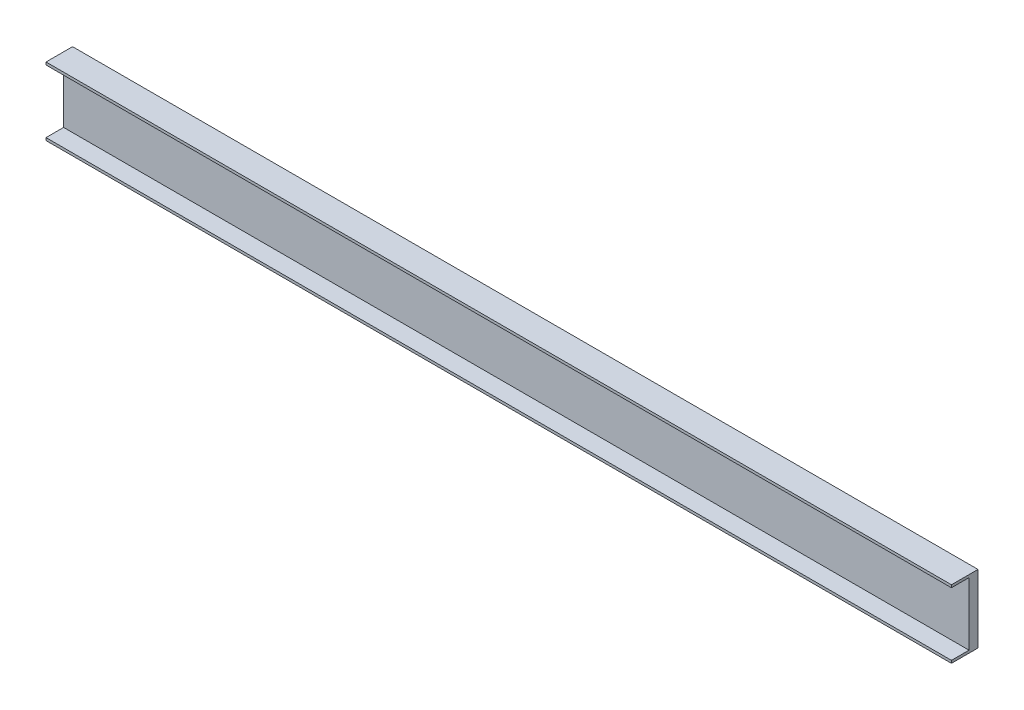
ISO-10303-21;
HEADER;
FILE_DESCRIPTION(('STEP AP214'),'2;1');
FILE_NAME('part.step','',(''),(''),'','','');
FILE_SCHEMA(('AUTOMOTIVE_DESIGN { 1 0 10303 214 1 1 1 1 }'));
ENDSEC;
DATA;
#1=APPLICATION_CONTEXT('core data for automotive mechanical design processes');
#2=APPLICATION_PROTOCOL_DEFINITION('international standard','automotive_design',2000,#1);
#3=PRODUCT_CONTEXT('',#1,'mechanical');
#4=PRODUCT('Part','Part','',(#3));
#5=PRODUCT_RELATED_PRODUCT_CATEGORY('part','',(#4));
#6=PRODUCT_DEFINITION_FORMATION('','',#4);
#7=PRODUCT_DEFINITION_CONTEXT('part definition',#1,'design');
#8=PRODUCT_DEFINITION('design','',#6,#7);
#9=PRODUCT_DEFINITION_SHAPE('','',#8);
#10=(LENGTH_UNIT() NAMED_UNIT(*) SI_UNIT(.MILLI.,.METRE.));
#11=(NAMED_UNIT(*) PLANE_ANGLE_UNIT() SI_UNIT($,.RADIAN.));
#12=(NAMED_UNIT(*) SI_UNIT($,.STERADIAN.) SOLID_ANGLE_UNIT());
#13=UNCERTAINTY_MEASURE_WITH_UNIT(LENGTH_MEASURE(1.E-05),#10,'distance_accuracy_value','');
#14=(GEOMETRIC_REPRESENTATION_CONTEXT(3) GLOBAL_UNCERTAINTY_ASSIGNED_CONTEXT((#13)) GLOBAL_UNIT_ASSIGNED_CONTEXT((#10,
#11,#12)) REPRESENTATION_CONTEXT('',''));
#15=CARTESIAN_POINT('',(0.,0.,0.));
#16=DIRECTION('',(0.,0.,1.));
#17=DIRECTION('',(1.,0.,0.));
#18=AXIS2_PLACEMENT_3D('',#15,#16,#17);
#19=CARTESIAN_POINT('',(-1995.,-150.,0.));
#20=DIRECTION('',(0.,0.,1.));
#21=DIRECTION('',(1.,0.,0.));
#22=AXIS2_PLACEMENT_3D('',#19,#20,#21);
#23=PLANE('',#22);
#24=DIRECTION('',(0.,1.,0.));
#25=VECTOR('',#24,1.);
#26=CARTESIAN_POINT('',(865.,115.,0.));
#27=LINE('',#26,#25);
#28=CARTESIAN_POINT('',(865.,-115.,0.));
#29=VERTEX_POINT('',#28);
#30=CARTESIAN_POINT('',(865.,115.,0.));
#31=VERTEX_POINT('',#30);
#32=EDGE_CURVE('E265',#29,#31,#27,.T.);
#33=ORIENTED_EDGE('',*,*,#32,.F.);
#34=DIRECTION('',(-1.,0.,0.));
#35=VECTOR('',#34,1.);
#36=CARTESIAN_POINT('',(865.,-115.,0.));
#37=LINE('',#36,#35);
#38=CARTESIAN_POINT('',(935.,-115.,0.));
#39=VERTEX_POINT('',#38);
#40=EDGE_CURVE('E278',#39,#29,#37,.T.);
#41=ORIENTED_EDGE('',*,*,#40,.F.);
#42=DIRECTION('',(0.,-1.,0.));
#43=VECTOR('',#42,1.);
#44=CARTESIAN_POINT('',(935.,115.,0.));
#45=LINE('',#44,#43);
#46=CARTESIAN_POINT('',(935.,115.,0.));
#47=VERTEX_POINT('',#46);
#48=EDGE_CURVE('E287',#47,#39,#45,.T.);
#49=ORIENTED_EDGE('',*,*,#48,.F.);
#50=DIRECTION('',(1.,0.,0.));
#51=VECTOR('',#50,1.);
#52=CARTESIAN_POINT('',(865.,115.,0.));
#53=LINE('',#52,#51);
#54=EDGE_CURVE('E268',#31,#47,#53,.T.);
#55=ORIENTED_EDGE('',*,*,#54,.F.);
#56=EDGE_LOOP('',(#33,#41,#49,#55));
#57=FACE_BOUND('',#56,.T.);
#58=DIRECTION('',(0.,1.,0.));
#59=VECTOR('',#58,1.);
#60=CARTESIAN_POINT('',(-535.,-115.,0.));
#61=LINE('',#60,#59);
#62=CARTESIAN_POINT('',(-535.,-115.,0.));
#63=VERTEX_POINT('',#62);
#64=CARTESIAN_POINT('',(-535.,115.,0.));
#65=VERTEX_POINT('',#64);
#66=EDGE_CURVE('E336',#63,#65,#61,.T.);
#67=ORIENTED_EDGE('',*,*,#66,.F.);
#68=DIRECTION('',(-1.,0.,0.));
#69=VECTOR('',#68,1.);
#70=CARTESIAN_POINT('',(-535.,-115.,0.));
#71=LINE('',#70,#69);
#72=CARTESIAN_POINT('',(-465.,-115.,0.));
#73=VERTEX_POINT('',#72);
#74=EDGE_CURVE('E341',#73,#63,#71,.T.);
#75=ORIENTED_EDGE('',*,*,#74,.F.);
#76=DIRECTION('',(0.,-1.,0.));
#77=VECTOR('',#76,1.);
#78=CARTESIAN_POINT('',(-465.,-115.,0.));
#79=LINE('',#78,#77);
#80=CARTESIAN_POINT('',(-465.,115.,0.));
#81=VERTEX_POINT('',#80);
#82=EDGE_CURVE('E353',#81,#73,#79,.T.);
#83=ORIENTED_EDGE('',*,*,#82,.F.);
#84=DIRECTION('',(1.,0.,0.));
#85=VECTOR('',#84,1.);
#86=CARTESIAN_POINT('',(-535.,115.,0.));
#87=LINE('',#86,#85);
#88=EDGE_CURVE('E350',#65,#81,#87,.T.);
#89=ORIENTED_EDGE('',*,*,#88,.F.);
#90=EDGE_LOOP('',(#67,#75,#83,#89));
#91=FACE_BOUND('',#90,.T.);
#92=DIRECTION('',(0.,-1.,0.));
#93=VECTOR('',#92,1.);
#94=CARTESIAN_POINT('',(-1265.,115.,0.));
#95=LINE('',#94,#93);
#96=CARTESIAN_POINT('',(-1265.,115.,0.));
#97=VERTEX_POINT('',#96);
#98=CARTESIAN_POINT('',(-1265.,-115.,0.));
#99=VERTEX_POINT('',#98);
#100=EDGE_CURVE('E402',#97,#99,#95,.T.);
#101=ORIENTED_EDGE('',*,*,#100,.F.);
#102=DIRECTION('',(1.,0.,0.));
#103=VECTOR('',#102,1.);
#104=CARTESIAN_POINT('',(-1265.,115.,0.));
#105=LINE('',#104,#103);
#106=CARTESIAN_POINT('',(-1335.,115.,0.));
#107=VERTEX_POINT('',#106);
#108=EDGE_CURVE('E407',#107,#97,#105,.T.);
#109=ORIENTED_EDGE('',*,*,#108,.F.);
#110=DIRECTION('',(0.,1.,0.));
#111=VECTOR('',#110,1.);
#112=CARTESIAN_POINT('',(-1335.,115.,0.));
#113=LINE('',#112,#111);
#114=CARTESIAN_POINT('',(-1335.,-115.,0.));
#115=VERTEX_POINT('',#114);
#116=EDGE_CURVE('E419',#115,#107,#113,.T.);
#117=ORIENTED_EDGE('',*,*,#116,.F.);
#118=DIRECTION('',(-1.,0.,0.));
#119=VECTOR('',#118,1.);
#120=CARTESIAN_POINT('',(-1265.,-115.,0.));
#121=LINE('',#120,#119);
#122=EDGE_CURVE('E416',#99,#115,#121,.T.);
#123=ORIENTED_EDGE('',*,*,#122,.F.);
#124=EDGE_LOOP('',(#101,#109,#117,#123));
#125=FACE_BOUND('',#124,.T.);
#126=DIRECTION('',(0.,-1.,0.));
#127=VECTOR('',#126,1.);
#128=CARTESIAN_POINT('',(-1995.,150.,0.));
#129=LINE('',#128,#127);
#130=CARTESIAN_POINT('',(-1995.,150.,0.));
#131=VERTEX_POINT('',#130);
#132=CARTESIAN_POINT('',(-1995.,-150.,0.));
#133=VERTEX_POINT('',#132);
#134=EDGE_CURVE('E481',#131,#133,#129,.T.);
#135=ORIENTED_EDGE('',*,*,#134,.F.);
#136=DIRECTION('',(-1.,0.,0.));
#137=VECTOR('',#136,1.);
#138=CARTESIAN_POINT('',(-1995.,150.,0.));
#139=LINE('',#138,#137);
#140=CARTESIAN_POINT('',(1995.,150.,0.));
#141=VERTEX_POINT('',#140);
#142=EDGE_CURVE('E496',#141,#131,#139,.T.);
#143=ORIENTED_EDGE('',*,*,#142,.F.);
#144=DIRECTION('',(0.,1.,0.));
#145=VECTOR('',#144,1.);
#146=CARTESIAN_POINT('',(1995.,150.,0.));
#147=LINE('',#146,#145);
#148=CARTESIAN_POINT('',(1995.,-150.,0.));
#149=VERTEX_POINT('',#148);
#150=EDGE_CURVE('E491',#149,#141,#147,.T.);
#151=ORIENTED_EDGE('',*,*,#150,.F.);
#152=DIRECTION('',(1.,0.,0.));
#153=VECTOR('',#152,1.);
#154=CARTESIAN_POINT('',(-1995.,-150.,0.));
#155=LINE('',#154,#153);
#156=EDGE_CURVE('E486',#133,#149,#155,.T.);
#157=ORIENTED_EDGE('',*,*,#156,.F.);
#158=EDGE_LOOP('',(#135,#143,#151,#157));
#159=FACE_BOUND('',#158,.T.);
#160=DIRECTION('',(0.,-1.,0.));
#161=VECTOR('',#160,1.);
#162=CARTESIAN_POINT('',(-865.,115.,0.));
#163=LINE('',#162,#161);
#164=CARTESIAN_POINT('',(-865.,115.,0.));
#165=VERTEX_POINT('',#164);
#166=CARTESIAN_POINT('',(-865.,-115.,0.));
#167=VERTEX_POINT('',#166);
#168=EDGE_CURVE('E369',#165,#167,#163,.T.);
#169=ORIENTED_EDGE('',*,*,#168,.F.);
#170=DIRECTION('',(1.,0.,0.));
#171=VECTOR('',#170,1.);
#172=CARTESIAN_POINT('',(-865.,115.,0.));
#173=LINE('',#172,#171);
#174=CARTESIAN_POINT('',(-935.,115.,0.));
#175=VERTEX_POINT('',#174);
#176=EDGE_CURVE('E374',#175,#165,#173,.T.);
#177=ORIENTED_EDGE('',*,*,#176,.F.);
#178=DIRECTION('',(0.,1.,0.));
#179=VECTOR('',#178,1.);
#180=CARTESIAN_POINT('',(-935.,115.,0.));
#181=LINE('',#180,#179);
#182=CARTESIAN_POINT('',(-935.,-115.,0.));
#183=VERTEX_POINT('',#182);
#184=EDGE_CURVE('E386',#183,#175,#181,.T.);
#185=ORIENTED_EDGE('',*,*,#184,.F.);
#186=DIRECTION('',(-1.,0.,0.));
#187=VECTOR('',#186,1.);
#188=CARTESIAN_POINT('',(-865.,-115.,0.));
#189=LINE('',#188,#187);
#190=EDGE_CURVE('E383',#167,#183,#189,.T.);
#191=ORIENTED_EDGE('',*,*,#190,.F.);
#192=EDGE_LOOP('',(#169,#177,#185,#191));
#193=FACE_BOUND('',#192,.T.);
#194=DIRECTION('',(0.,1.,0.));
#195=VECTOR('',#194,1.);
#196=CARTESIAN_POINT('',(1265.,115.,0.));
#197=LINE('',#196,#195);
#198=CARTESIAN_POINT('',(1265.,-115.,0.));
#199=VERTEX_POINT('',#198);
#200=CARTESIAN_POINT('',(1265.,115.,0.));
#201=VERTEX_POINT('',#200);
#202=EDGE_CURVE('E303',#199,#201,#197,.T.);
#203=ORIENTED_EDGE('',*,*,#202,.F.);
#204=DIRECTION('',(-1.,0.,0.));
#205=VECTOR('',#204,1.);
#206=CARTESIAN_POINT('',(1265.,-115.,0.));
#207=LINE('',#206,#205);
#208=CARTESIAN_POINT('',(1335.,-115.,0.));
#209=VERTEX_POINT('',#208);
#210=EDGE_CURVE('E308',#209,#199,#207,.T.);
#211=ORIENTED_EDGE('',*,*,#210,.F.);
#212=DIRECTION('',(0.,-1.,0.));
#213=VECTOR('',#212,1.);
#214=CARTESIAN_POINT('',(1335.,115.,0.));
#215=LINE('',#214,#213);
#216=CARTESIAN_POINT('',(1335.,115.,0.));
#217=VERTEX_POINT('',#216);
#218=EDGE_CURVE('E320',#217,#209,#215,.T.);
#219=ORIENTED_EDGE('',*,*,#218,.F.);
#220=DIRECTION('',(1.,0.,0.));
#221=VECTOR('',#220,1.);
#222=CARTESIAN_POINT('',(1265.,115.,0.));
#223=LINE('',#222,#221);
#224=EDGE_CURVE('E317',#201,#217,#223,.T.);
#225=ORIENTED_EDGE('',*,*,#224,.F.);
#226=EDGE_LOOP('',(#203,#211,#219,#225));
#227=FACE_BOUND('',#226,.T.);
#228=DIRECTION('',(-1.,0.,0.));
#229=VECTOR('',#228,1.);
#230=CARTESIAN_POINT('',(535.,-115.,0.));
#231=LINE('',#230,#229);
#232=CARTESIAN_POINT('',(535.,-115.,0.));
#233=VERTEX_POINT('',#232);
#234=CARTESIAN_POINT('',(465.,-115.,0.));
#235=VERTEX_POINT('',#234);
#236=EDGE_CURVE('E264',#233,#235,#231,.T.);
#237=ORIENTED_EDGE('',*,*,#236,.F.);
#238=DIRECTION('',(0.,-1.,0.));
#239=VECTOR('',#238,1.);
#240=CARTESIAN_POINT('',(535.,-115.,0.));
#241=LINE('',#240,#239);
#242=CARTESIAN_POINT('',(535.,115.,0.));
#243=VERTEX_POINT('',#242);
#244=EDGE_CURVE('E261',#243,#233,#241,.T.);
#245=ORIENTED_EDGE('',*,*,#244,.F.);
#246=DIRECTION('',(1.,0.,0.));
#247=VECTOR('',#246,1.);
#248=CARTESIAN_POINT('',(535.,115.,0.));
#249=LINE('',#248,#247);
#250=CARTESIAN_POINT('',(465.,115.,0.));
#251=VERTEX_POINT('',#250);
#252=EDGE_CURVE('E55',#251,#243,#249,.T.);
#253=ORIENTED_EDGE('',*,*,#252,.F.);
#254=DIRECTION('',(0.,1.,0.));
#255=VECTOR('',#254,1.);
#256=CARTESIAN_POINT('',(465.,-115.,0.));
#257=LINE('',#256,#255);
#258=EDGE_CURVE('E50',#235,#251,#257,.T.);
#259=ORIENTED_EDGE('',*,*,#258,.F.);
#260=EDGE_LOOP('',(#237,#245,#253,#259));
#261=FACE_BOUND('',#260,.T.);
#262=ADVANCED_FACE('F32',(#57,#91,#125,#159,#193,#227,#261),#23,.F.);
#263=CARTESIAN_POINT('',(-1995.,-150.,39.5));
#264=DIRECTION('',(0.,0.,1.));
#265=DIRECTION('',(1.,0.,0.));
#266=AXIS2_PLACEMENT_3D('',#263,#264,#265);
#267=PLANE('',#266);
#268=DIRECTION('',(0.,-1.,0.));
#269=VECTOR('',#268,1.);
#270=CARTESIAN_POINT('',(-1995.,150.,39.5));
#271=LINE('',#270,#269);
#272=CARTESIAN_POINT('',(-1995.,138.5,39.5));
#273=VERTEX_POINT('',#272);
#274=CARTESIAN_POINT('',(-1995.,-138.5,39.5));
#275=VERTEX_POINT('',#274);
#276=EDGE_CURVE('E474',#273,#275,#271,.T.);
#277=ORIENTED_EDGE('',*,*,#276,.T.);
#278=DIRECTION('',(-1.,0.,0.));
#279=VECTOR('',#278,1.);
#280=CARTESIAN_POINT('',(-1995.,-138.5,39.5));
#281=LINE('',#280,#279);
#282=CARTESIAN_POINT('',(1995.,-138.5,39.5));
#283=VERTEX_POINT('',#282);
#284=EDGE_CURVE('E435',#283,#275,#281,.T.);
#285=ORIENTED_EDGE('',*,*,#284,.F.);
#286=DIRECTION('',(0.,1.,0.));
#287=VECTOR('',#286,1.);
#288=CARTESIAN_POINT('',(1995.,150.,39.5));
#289=LINE('',#288,#287);
#290=CARTESIAN_POINT('',(1995.,138.5,39.5));
#291=VERTEX_POINT('',#290);
#292=EDGE_CURVE('E36',#283,#291,#289,.T.);
#293=ORIENTED_EDGE('',*,*,#292,.T.);
#294=DIRECTION('',(1.,0.,0.));
#295=VECTOR('',#294,1.);
#296=CARTESIAN_POINT('',(-1995.,138.5,39.5));
#297=LINE('',#296,#295);
#298=EDGE_CURVE('E454',#273,#291,#297,.T.);
#299=ORIENTED_EDGE('',*,*,#298,.F.);
#300=EDGE_LOOP('',(#277,#285,#293,#299));
#301=FACE_BOUND('',#300,.T.);
#302=ADVANCED_FACE('F526',(#301),#267,.T.);
#303=CARTESIAN_POINT('',(-1995.,150.,39.5));
#304=DIRECTION('',(1.,0.,0.));
#305=DIRECTION('',(0.,0.,-1.));
#306=AXIS2_PLACEMENT_3D('',#303,#304,#305);
#307=PLANE('',#306);
#308=ORIENTED_EDGE('',*,*,#134,.T.);
#309=DIRECTION('',(0.,0.,-1.));
#310=VECTOR('',#309,1.);
#311=CARTESIAN_POINT('',(-1995.,-150.,39.5));
#312=LINE('',#311,#310);
#313=CARTESIAN_POINT('',(-1995.,-150.,117.));
#314=VERTEX_POINT('',#313);
#315=EDGE_CURVE('E11',#314,#133,#312,.T.);
#316=ORIENTED_EDGE('',*,*,#315,.F.);
#317=DIRECTION('',(0.,-1.,0.));
#318=VECTOR('',#317,1.);
#319=CARTESIAN_POINT('',(-1995.,-150.,117.));
#320=LINE('',#319,#318);
#321=CARTESIAN_POINT('',(-1995.,-138.5,117.));
#322=VERTEX_POINT('',#321);
#323=EDGE_CURVE('E443',#322,#314,#320,.T.);
#324=ORIENTED_EDGE('',*,*,#323,.F.);
#325=DIRECTION('',(0.,0.,-1.));
#326=VECTOR('',#325,1.);
#327=CARTESIAN_POINT('',(-1995.,-138.5,117.));
#328=LINE('',#327,#326);
#329=EDGE_CURVE('E446',#322,#275,#328,.T.);
#330=ORIENTED_EDGE('',*,*,#329,.T.);
#331=ORIENTED_EDGE('',*,*,#276,.F.);
#332=DIRECTION('',(0.,0.,-1.));
#333=VECTOR('',#332,1.);
#334=CARTESIAN_POINT('',(-1995.,138.5,117.));
#335=LINE('',#334,#333);
#336=CARTESIAN_POINT('',(-1995.,138.5,117.));
#337=VERTEX_POINT('',#336);
#338=EDGE_CURVE('E477',#337,#273,#335,.T.);
#339=ORIENTED_EDGE('',*,*,#338,.F.);
#340=DIRECTION('',(0.,-1.,0.));
#341=VECTOR('',#340,1.);
#342=CARTESIAN_POINT('',(-1995.,150.,117.));
#343=LINE('',#342,#341);
#344=CARTESIAN_POINT('',(-1995.,150.,117.));
#345=VERTEX_POINT('',#344);
#346=EDGE_CURVE('E455',#345,#337,#343,.T.);
#347=ORIENTED_EDGE('',*,*,#346,.F.);
#348=DIRECTION('',(0.,0.,-1.));
#349=VECTOR('',#348,1.);
#350=CARTESIAN_POINT('',(-1995.,150.,39.5));
#351=LINE('',#350,#349);
#352=EDGE_CURVE('E498',#345,#131,#351,.T.);
#353=ORIENTED_EDGE('',*,*,#352,.T.);
#354=EDGE_LOOP('',(#308,#316,#324,#330,#331,#339,#347,#353));
#355=FACE_BOUND('',#354,.T.);
#356=ADVANCED_FACE('F34',(#355),#307,.F.);
#357=CARTESIAN_POINT('',(-1995.,-150.,39.5));
#358=DIRECTION('',(0.,1.,0.));
#359=DIRECTION('',(-1.,0.,0.));
#360=AXIS2_PLACEMENT_3D('',#357,#358,#359);
#361=PLANE('',#360);
#362=ORIENTED_EDGE('',*,*,#156,.T.);
#363=DIRECTION('',(0.,0.,-1.));
#364=VECTOR('',#363,1.);
#365=CARTESIAN_POINT('',(1995.,-150.,39.5));
#366=LINE('',#365,#364);
#367=CARTESIAN_POINT('',(1995.,-150.,117.));
#368=VERTEX_POINT('',#367);
#369=EDGE_CURVE('E42',#368,#149,#366,.T.);
#370=ORIENTED_EDGE('',*,*,#369,.F.);
#371=DIRECTION('',(1.,0.,0.));
#372=VECTOR('',#371,1.);
#373=CARTESIAN_POINT('',(-1995.,-150.,117.));
#374=LINE('',#373,#372);
#375=EDGE_CURVE('E436',#314,#368,#374,.T.);
#376=ORIENTED_EDGE('',*,*,#375,.F.);
#377=ORIENTED_EDGE('',*,*,#315,.T.);
#378=EDGE_LOOP('',(#362,#370,#376,#377));
#379=FACE_BOUND('',#378,.T.);
#380=ADVANCED_FACE('F534',(#379),#361,.F.);
#381=CARTESIAN_POINT('',(1995.,150.,39.5));
#382=DIRECTION('',(-1.,0.,0.));
#383=DIRECTION('',(0.,0.,1.));
#384=AXIS2_PLACEMENT_3D('',#381,#382,#383);
#385=PLANE('',#384);
#386=ORIENTED_EDGE('',*,*,#150,.T.);
#387=DIRECTION('',(0.,0.,-1.));
#388=VECTOR('',#387,1.);
#389=CARTESIAN_POINT('',(1995.,150.,39.5));
#390=LINE('',#389,#388);
#391=CARTESIAN_POINT('',(1995.,150.,117.));
#392=VERTEX_POINT('',#391);
#393=EDGE_CURVE('E500',#392,#141,#390,.T.);
#394=ORIENTED_EDGE('',*,*,#393,.F.);
#395=DIRECTION('',(0.,1.,0.));
#396=VECTOR('',#395,1.);
#397=CARTESIAN_POINT('',(1995.,150.,117.));
#398=LINE('',#397,#396);
#399=CARTESIAN_POINT('',(1995.,138.5,117.));
#400=VERTEX_POINT('',#399);
#401=EDGE_CURVE('E460',#400,#392,#398,.T.);
#402=ORIENTED_EDGE('',*,*,#401,.F.);
#403=DIRECTION('',(0.,0.,-1.));
#404=VECTOR('',#403,1.);
#405=CARTESIAN_POINT('',(1995.,138.5,117.));
#406=LINE('',#405,#404);
#407=EDGE_CURVE('E466',#400,#291,#406,.T.);
#408=ORIENTED_EDGE('',*,*,#407,.T.);
#409=ORIENTED_EDGE('',*,*,#292,.F.);
#410=DIRECTION('',(0.,0.,-1.));
#411=VECTOR('',#410,1.);
#412=CARTESIAN_POINT('',(1995.,-138.5,117.));
#413=LINE('',#412,#411);
#414=CARTESIAN_POINT('',(1995.,-138.5,117.));
#415=VERTEX_POINT('',#414);
#416=EDGE_CURVE('E451',#415,#283,#413,.T.);
#417=ORIENTED_EDGE('',*,*,#416,.F.);
#418=DIRECTION('',(0.,1.,0.));
#419=VECTOR('',#418,1.);
#420=CARTESIAN_POINT('',(1995.,-150.,117.));
#421=LINE('',#420,#419);
#422=EDGE_CURVE('E439',#368,#415,#421,.T.);
#423=ORIENTED_EDGE('',*,*,#422,.F.);
#424=ORIENTED_EDGE('',*,*,#369,.T.);
#425=EDGE_LOOP('',(#386,#394,#402,#408,#409,#417,#423,#424));
#426=FACE_BOUND('',#425,.T.);
#427=ADVANCED_FACE('F507',(#426),#385,.F.);
#428=CARTESIAN_POINT('',(-1995.,150.,39.5));
#429=DIRECTION('',(0.,-1.,0.));
#430=DIRECTION('',(1.,0.,0.));
#431=AXIS2_PLACEMENT_3D('',#428,#429,#430);
#432=PLANE('',#431);
#433=ORIENTED_EDGE('',*,*,#142,.T.);
#434=ORIENTED_EDGE('',*,*,#352,.F.);
#435=DIRECTION('',(-1.,0.,0.));
#436=VECTOR('',#435,1.);
#437=CARTESIAN_POINT('',(-1995.,150.,117.));
#438=LINE('',#437,#436);
#439=EDGE_CURVE('E463',#392,#345,#438,.T.);
#440=ORIENTED_EDGE('',*,*,#439,.F.);
#441=ORIENTED_EDGE('',*,*,#393,.T.);
#442=EDGE_LOOP('',(#433,#434,#440,#441));
#443=FACE_BOUND('',#442,.T.);
#444=ADVANCED_FACE('F515',(#443),#432,.F.);
#445=CARTESIAN_POINT('',(-1995.,138.5,117.));
#446=DIRECTION('',(0.,1.,0.));
#447=DIRECTION('',(0.,0.,1.));
#448=AXIS2_PLACEMENT_3D('',#445,#446,#447);
#449=PLANE('',#448);
#450=ORIENTED_EDGE('',*,*,#298,.T.);
#451=ORIENTED_EDGE('',*,*,#407,.F.);
#452=DIRECTION('',(1.,0.,0.));
#453=VECTOR('',#452,1.);
#454=CARTESIAN_POINT('',(-1995.,138.5,117.));
#455=LINE('',#454,#453);
#456=EDGE_CURVE('E458',#337,#400,#455,.T.);
#457=ORIENTED_EDGE('',*,*,#456,.F.);
#458=ORIENTED_EDGE('',*,*,#338,.T.);
#459=EDGE_LOOP('',(#450,#451,#457,#458));
#460=FACE_BOUND('',#459,.T.);
#461=ADVANCED_FACE('F524',(#460),#449,.F.);
#462=CARTESIAN_POINT('',(-1995.,138.5,117.));
#463=DIRECTION('',(0.,0.,1.));
#464=DIRECTION('',(1.,0.,0.));
#465=AXIS2_PLACEMENT_3D('',#462,#463,#464);
#466=PLANE('',#465);
#467=ORIENTED_EDGE('',*,*,#346,.T.);
#468=ORIENTED_EDGE('',*,*,#456,.T.);
#469=ORIENTED_EDGE('',*,*,#401,.T.);
#470=ORIENTED_EDGE('',*,*,#439,.T.);
#471=EDGE_LOOP('',(#467,#468,#469,#470));
#472=FACE_BOUND('',#471,.T.);
#473=ADVANCED_FACE('F520',(#472),#466,.T.);
#474=CARTESIAN_POINT('',(-1995.,-138.5,117.));
#475=DIRECTION('',(0.,-1.,0.));
#476=DIRECTION('',(0.,0.,-1.));
#477=AXIS2_PLACEMENT_3D('',#474,#475,#476);
#478=PLANE('',#477);
#479=ORIENTED_EDGE('',*,*,#284,.T.);
#480=ORIENTED_EDGE('',*,*,#329,.F.);
#481=DIRECTION('',(-1.,0.,0.));
#482=VECTOR('',#481,1.);
#483=CARTESIAN_POINT('',(-1995.,-138.5,117.));
#484=LINE('',#483,#482);
#485=EDGE_CURVE('E441',#415,#322,#484,.T.);
#486=ORIENTED_EDGE('',*,*,#485,.F.);
#487=ORIENTED_EDGE('',*,*,#416,.T.);
#488=EDGE_LOOP('',(#479,#480,#486,#487));
#489=FACE_BOUND('',#488,.T.);
#490=ADVANCED_FACE('F531',(#489),#478,.F.);
#491=CARTESIAN_POINT('',(1995.,-150.,117.));
#492=DIRECTION('',(0.,0.,1.));
#493=DIRECTION('',(1.,0.,0.));
#494=AXIS2_PLACEMENT_3D('',#491,#492,#493);
#495=PLANE('',#494);
#496=ORIENTED_EDGE('',*,*,#375,.T.);
#497=ORIENTED_EDGE('',*,*,#422,.T.);
#498=ORIENTED_EDGE('',*,*,#485,.T.);
#499=ORIENTED_EDGE('',*,*,#323,.T.);
#500=EDGE_LOOP('',(#496,#497,#498,#499));
#501=FACE_BOUND('',#500,.T.);
#502=ADVANCED_FACE('F533',(#501),#495,.T.);
#503=CARTESIAN_POINT('',(-1265.,115.,-16.));
#504=DIRECTION('',(-1.,0.,0.));
#505=DIRECTION('',(0.,0.,1.));
#506=AXIS2_PLACEMENT_3D('',#503,#504,#505);
#507=PLANE('',#506);
#508=ORIENTED_EDGE('',*,*,#100,.T.);
#509=DIRECTION('',(0.,0.,1.));
#510=VECTOR('',#509,1.);
#511=CARTESIAN_POINT('',(-1265.,-115.,-16.));
#512=LINE('',#511,#510);
#513=CARTESIAN_POINT('',(-1265.,-115.,-16.));
#514=VERTEX_POINT('',#513);
#515=EDGE_CURVE('E432',#514,#99,#512,.T.);
#516=ORIENTED_EDGE('',*,*,#515,.F.);
#517=DIRECTION('',(0.,-1.,0.));
#518=VECTOR('',#517,1.);
#519=CARTESIAN_POINT('',(-1265.,115.,-16.));
#520=LINE('',#519,#518);
#521=CARTESIAN_POINT('',(-1265.,115.,-16.));
#522=VERTEX_POINT('',#521);
#523=EDGE_CURVE('E403',#522,#514,#520,.T.);
#524=ORIENTED_EDGE('',*,*,#523,.F.);
#525=DIRECTION('',(0.,0.,1.));
#526=VECTOR('',#525,1.);
#527=CARTESIAN_POINT('',(-1265.,115.,-16.));
#528=LINE('',#527,#526);
#529=EDGE_CURVE('E413',#522,#97,#528,.T.);
#530=ORIENTED_EDGE('',*,*,#529,.T.);
#531=EDGE_LOOP('',(#508,#516,#524,#530));
#532=FACE_BOUND('',#531,.T.);
#533=ADVANCED_FACE('F564',(#532),#507,.F.);
#534=CARTESIAN_POINT('',(-1265.,-115.,-16.));
#535=DIRECTION('',(0.,1.,0.));
#536=DIRECTION('',(-1.,0.,0.));
#537=AXIS2_PLACEMENT_3D('',#534,#535,#536);
#538=PLANE('',#537);
#539=ORIENTED_EDGE('',*,*,#122,.T.);
#540=DIRECTION('',(0.,0.,1.));
#541=VECTOR('',#540,1.);
#542=CARTESIAN_POINT('',(-1335.,-115.,-16.));
#543=LINE('',#542,#541);
#544=CARTESIAN_POINT('',(-1335.,-115.,-16.));
#545=VERTEX_POINT('',#544);
#546=EDGE_CURVE('E429',#545,#115,#543,.T.);
#547=ORIENTED_EDGE('',*,*,#546,.F.);
#548=DIRECTION('',(-1.,0.,0.));
#549=VECTOR('',#548,1.);
#550=CARTESIAN_POINT('',(-1265.,-115.,-16.));
#551=LINE('',#550,#549);
#552=EDGE_CURVE('E406',#514,#545,#551,.T.);
#553=ORIENTED_EDGE('',*,*,#552,.F.);
#554=ORIENTED_EDGE('',*,*,#515,.T.);
#555=EDGE_LOOP('',(#539,#547,#553,#554));
#556=FACE_BOUND('',#555,.T.);
#557=ADVANCED_FACE('F567',(#556),#538,.F.);
#558=CARTESIAN_POINT('',(-1335.,115.,-16.));
#559=DIRECTION('',(1.,0.,0.));
#560=DIRECTION('',(0.,1.,0.));
#561=AXIS2_PLACEMENT_3D('',#558,#559,#560);
#562=PLANE('',#561);
#563=ORIENTED_EDGE('',*,*,#116,.T.);
#564=DIRECTION('',(0.,0.,1.));
#565=VECTOR('',#564,1.);
#566=CARTESIAN_POINT('',(-1335.,115.,-16.));
#567=LINE('',#566,#565);
#568=CARTESIAN_POINT('',(-1335.,115.,-16.));
#569=VERTEX_POINT('',#568);
#570=EDGE_CURVE('E426',#569,#107,#567,.T.);
#571=ORIENTED_EDGE('',*,*,#570,.F.);
#572=DIRECTION('',(0.,1.,0.));
#573=VECTOR('',#572,1.);
#574=CARTESIAN_POINT('',(-1335.,115.,-16.));
#575=LINE('',#574,#573);
#576=EDGE_CURVE('E409',#545,#569,#575,.T.);
#577=ORIENTED_EDGE('',*,*,#576,.F.);
#578=ORIENTED_EDGE('',*,*,#546,.T.);
#579=EDGE_LOOP('',(#563,#571,#577,#578));
#580=FACE_BOUND('',#579,.T.);
#581=ADVANCED_FACE('F571',(#580),#562,.F.);
#582=CARTESIAN_POINT('',(-1265.,115.,-16.));
#583=DIRECTION('',(0.,-1.,0.));
#584=DIRECTION('',(1.,0.,0.));
#585=AXIS2_PLACEMENT_3D('',#582,#583,#584);
#586=PLANE('',#585);
#587=ORIENTED_EDGE('',*,*,#108,.T.);
#588=ORIENTED_EDGE('',*,*,#529,.F.);
#589=DIRECTION('',(1.,0.,0.));
#590=VECTOR('',#589,1.);
#591=CARTESIAN_POINT('',(-1265.,115.,-16.));
#592=LINE('',#591,#590);
#593=EDGE_CURVE('E411',#569,#522,#592,.T.);
#594=ORIENTED_EDGE('',*,*,#593,.F.);
#595=ORIENTED_EDGE('',*,*,#570,.T.);
#596=EDGE_LOOP('',(#587,#588,#594,#595));
#597=FACE_BOUND('',#596,.T.);
#598=ADVANCED_FACE('F575',(#597),#586,.F.);
#599=CARTESIAN_POINT('',(-1265.,115.,-16.));
#600=DIRECTION('',(0.,0.,-1.));
#601=DIRECTION('',(-1.,0.,0.));
#602=AXIS2_PLACEMENT_3D('',#599,#600,#601);
#603=PLANE('',#602);
#604=ORIENTED_EDGE('',*,*,#523,.T.);
#605=ORIENTED_EDGE('',*,*,#552,.T.);
#606=ORIENTED_EDGE('',*,*,#576,.T.);
#607=ORIENTED_EDGE('',*,*,#593,.T.);
#608=EDGE_LOOP('',(#604,#605,#606,#607));
#609=FACE_BOUND('',#608,.T.);
#610=ADVANCED_FACE('F579',(#609),#603,.T.);
#611=CARTESIAN_POINT('',(-865.,115.,-16.));
#612=DIRECTION('',(-1.,0.,0.));
#613=DIRECTION('',(0.,-1.,0.));
#614=AXIS2_PLACEMENT_3D('',#611,#612,#613);
#615=PLANE('',#614);
#616=ORIENTED_EDGE('',*,*,#168,.T.);
#617=DIRECTION('',(0.,0.,1.));
#618=VECTOR('',#617,1.);
#619=CARTESIAN_POINT('',(-865.,-115.,-16.));
#620=LINE('',#619,#618);
#621=CARTESIAN_POINT('',(-865.,-115.,-16.));
#622=VERTEX_POINT('',#621);
#623=EDGE_CURVE('E399',#622,#167,#620,.T.);
#624=ORIENTED_EDGE('',*,*,#623,.F.);
#625=DIRECTION('',(0.,-1.,0.));
#626=VECTOR('',#625,1.);
#627=CARTESIAN_POINT('',(-865.,115.,-16.));
#628=LINE('',#627,#626);
#629=CARTESIAN_POINT('',(-865.,115.,-16.));
#630=VERTEX_POINT('',#629);
#631=EDGE_CURVE('E370',#630,#622,#628,.T.);
#632=ORIENTED_EDGE('',*,*,#631,.F.);
#633=DIRECTION('',(0.,0.,1.));
#634=VECTOR('',#633,1.);
#635=CARTESIAN_POINT('',(-865.,115.,-16.));
#636=LINE('',#635,#634);
#637=EDGE_CURVE('E380',#630,#165,#636,.T.);
#638=ORIENTED_EDGE('',*,*,#637,.T.);
#639=EDGE_LOOP('',(#616,#624,#632,#638));
#640=FACE_BOUND('',#639,.T.);
#641=ADVANCED_FACE('F583',(#640),#615,.F.);
#642=CARTESIAN_POINT('',(-865.,-115.,-16.));
#643=DIRECTION('',(0.,1.,0.));
#644=DIRECTION('',(-1.,0.,0.));
#645=AXIS2_PLACEMENT_3D('',#642,#643,#644);
#646=PLANE('',#645);
#647=ORIENTED_EDGE('',*,*,#190,.T.);
#648=DIRECTION('',(0.,0.,1.));
#649=VECTOR('',#648,1.);
#650=CARTESIAN_POINT('',(-935.,-115.,-16.));
#651=LINE('',#650,#649);
#652=CARTESIAN_POINT('',(-935.,-115.,-16.));
#653=VERTEX_POINT('',#652);
#654=EDGE_CURVE('E396',#653,#183,#651,.T.);
#655=ORIENTED_EDGE('',*,*,#654,.F.);
#656=DIRECTION('',(-1.,0.,0.));
#657=VECTOR('',#656,1.);
#658=CARTESIAN_POINT('',(-865.,-115.,-16.));
#659=LINE('',#658,#657);
#660=EDGE_CURVE('E373',#622,#653,#659,.T.);
#661=ORIENTED_EDGE('',*,*,#660,.F.);
#662=ORIENTED_EDGE('',*,*,#623,.T.);
#663=EDGE_LOOP('',(#647,#655,#661,#662));
#664=FACE_BOUND('',#663,.T.);
#665=ADVANCED_FACE('F587',(#664),#646,.F.);
#666=CARTESIAN_POINT('',(-935.,115.,-16.));
#667=DIRECTION('',(1.,0.,0.));
#668=DIRECTION('',(0.,0.,-1.));
#669=AXIS2_PLACEMENT_3D('',#666,#667,#668);
#670=PLANE('',#669);
#671=ORIENTED_EDGE('',*,*,#184,.T.);
#672=DIRECTION('',(0.,0.,1.));
#673=VECTOR('',#672,1.);
#674=CARTESIAN_POINT('',(-935.,115.,-16.));
#675=LINE('',#674,#673);
#676=CARTESIAN_POINT('',(-935.,115.,-16.));
#677=VERTEX_POINT('',#676);
#678=EDGE_CURVE('E393',#677,#175,#675,.T.);
#679=ORIENTED_EDGE('',*,*,#678,.F.);
#680=DIRECTION('',(0.,1.,0.));
#681=VECTOR('',#680,1.);
#682=CARTESIAN_POINT('',(-935.,115.,-16.));
#683=LINE('',#682,#681);
#684=EDGE_CURVE('E376',#653,#677,#683,.T.);
#685=ORIENTED_EDGE('',*,*,#684,.F.);
#686=ORIENTED_EDGE('',*,*,#654,.T.);
#687=EDGE_LOOP('',(#671,#679,#685,#686));
#688=FACE_BOUND('',#687,.T.);
#689=ADVANCED_FACE('F591',(#688),#670,.F.);
#690=CARTESIAN_POINT('',(-865.,115.,-16.));
#691=DIRECTION('',(0.,-1.,0.));
#692=DIRECTION('',(1.,0.,0.));
#693=AXIS2_PLACEMENT_3D('',#690,#691,#692);
#694=PLANE('',#693);
#695=ORIENTED_EDGE('',*,*,#176,.T.);
#696=ORIENTED_EDGE('',*,*,#637,.F.);
#697=DIRECTION('',(1.,0.,0.));
#698=VECTOR('',#697,1.);
#699=CARTESIAN_POINT('',(-865.,115.,-16.));
#700=LINE('',#699,#698);
#701=EDGE_CURVE('E378',#677,#630,#700,.T.);
#702=ORIENTED_EDGE('',*,*,#701,.F.);
#703=ORIENTED_EDGE('',*,*,#678,.T.);
#704=EDGE_LOOP('',(#695,#696,#702,#703));
#705=FACE_BOUND('',#704,.T.);
#706=ADVANCED_FACE('F595',(#705),#694,.F.);
#707=CARTESIAN_POINT('',(-865.,115.,-16.));
#708=DIRECTION('',(0.,0.,-1.));
#709=DIRECTION('',(-1.,0.,0.));
#710=AXIS2_PLACEMENT_3D('',#707,#708,#709);
#711=PLANE('',#710);
#712=ORIENTED_EDGE('',*,*,#631,.T.);
#713=ORIENTED_EDGE('',*,*,#660,.T.);
#714=ORIENTED_EDGE('',*,*,#684,.T.);
#715=ORIENTED_EDGE('',*,*,#701,.T.);
#716=EDGE_LOOP('',(#712,#713,#714,#715));
#717=FACE_BOUND('',#716,.T.);
#718=ADVANCED_FACE('F599',(#717),#711,.T.);
#719=CARTESIAN_POINT('',(-535.,-115.,-16.));
#720=DIRECTION('',(1.,0.,0.));
#721=DIRECTION('',(0.,0.,-1.));
#722=AXIS2_PLACEMENT_3D('',#719,#720,#721);
#723=PLANE('',#722);
#724=ORIENTED_EDGE('',*,*,#66,.T.);
#725=DIRECTION('',(0.,0.,1.));
#726=VECTOR('',#725,1.);
#727=CARTESIAN_POINT('',(-535.,115.,-16.));
#728=LINE('',#727,#726);
#729=CARTESIAN_POINT('',(-535.,115.,-16.));
#730=VERTEX_POINT('',#729);
#731=EDGE_CURVE('E366',#730,#65,#728,.T.);
#732=ORIENTED_EDGE('',*,*,#731,.F.);
#733=DIRECTION('',(0.,1.,0.));
#734=VECTOR('',#733,1.);
#735=CARTESIAN_POINT('',(-535.,-115.,-16.));
#736=LINE('',#735,#734);
#737=CARTESIAN_POINT('',(-535.,-115.,-16.));
#738=VERTEX_POINT('',#737);
#739=EDGE_CURVE('E337',#738,#730,#736,.T.);
#740=ORIENTED_EDGE('',*,*,#739,.F.);
#741=DIRECTION('',(0.,0.,1.));
#742=VECTOR('',#741,1.);
#743=CARTESIAN_POINT('',(-535.,-115.,-16.));
#744=LINE('',#743,#742);
#745=EDGE_CURVE('E347',#738,#63,#744,.T.);
#746=ORIENTED_EDGE('',*,*,#745,.T.);
#747=EDGE_LOOP('',(#724,#732,#740,#746));
#748=FACE_BOUND('',#747,.T.);
#749=ADVANCED_FACE('F603',(#748),#723,.F.);
#750=CARTESIAN_POINT('',(-535.,115.,-16.));
#751=DIRECTION('',(0.,-1.,0.));
#752=DIRECTION('',(0.,0.,-1.));
#753=AXIS2_PLACEMENT_3D('',#750,#751,#752);
#754=PLANE('',#753);
#755=ORIENTED_EDGE('',*,*,#88,.T.);
#756=DIRECTION('',(0.,0.,1.));
#757=VECTOR('',#756,1.);
#758=CARTESIAN_POINT('',(-465.,115.,-16.));
#759=LINE('',#758,#757);
#760=CARTESIAN_POINT('',(-465.,115.,-16.));
#761=VERTEX_POINT('',#760);
#762=EDGE_CURVE('E363',#761,#81,#759,.T.);
#763=ORIENTED_EDGE('',*,*,#762,.F.);
#764=DIRECTION('',(1.,0.,0.));
#765=VECTOR('',#764,1.);
#766=CARTESIAN_POINT('',(-535.,115.,-16.));
#767=LINE('',#766,#765);
#768=EDGE_CURVE('E340',#730,#761,#767,.T.);
#769=ORIENTED_EDGE('',*,*,#768,.F.);
#770=ORIENTED_EDGE('',*,*,#731,.T.);
#771=EDGE_LOOP('',(#755,#763,#769,#770));
#772=FACE_BOUND('',#771,.T.);
#773=ADVANCED_FACE('F607',(#772),#754,.F.);
#774=CARTESIAN_POINT('',(-465.,-115.,-16.));
#775=DIRECTION('',(-1.,0.,0.));
#776=DIRECTION('',(0.,0.,1.));
#777=AXIS2_PLACEMENT_3D('',#774,#775,#776);
#778=PLANE('',#777);
#779=ORIENTED_EDGE('',*,*,#82,.T.);
#780=DIRECTION('',(0.,0.,1.));
#781=VECTOR('',#780,1.);
#782=CARTESIAN_POINT('',(-465.,-115.,-16.));
#783=LINE('',#782,#781);
#784=CARTESIAN_POINT('',(-465.,-115.,-16.));
#785=VERTEX_POINT('',#784);
#786=EDGE_CURVE('E360',#785,#73,#783,.T.);
#787=ORIENTED_EDGE('',*,*,#786,.F.);
#788=DIRECTION('',(0.,-1.,0.));
#789=VECTOR('',#788,1.);
#790=CARTESIAN_POINT('',(-465.,-115.,-16.));
#791=LINE('',#790,#789);
#792=EDGE_CURVE('E343',#761,#785,#791,.T.);
#793=ORIENTED_EDGE('',*,*,#792,.F.);
#794=ORIENTED_EDGE('',*,*,#762,.T.);
#795=EDGE_LOOP('',(#779,#787,#793,#794));
#796=FACE_BOUND('',#795,.T.);
#797=ADVANCED_FACE('F611',(#796),#778,.F.);
#798=CARTESIAN_POINT('',(-535.,-115.,-16.));
#799=DIRECTION('',(0.,1.,0.));
#800=DIRECTION('',(0.,0.,1.));
#801=AXIS2_PLACEMENT_3D('',#798,#799,#800);
#802=PLANE('',#801);
#803=ORIENTED_EDGE('',*,*,#74,.T.);
#804=ORIENTED_EDGE('',*,*,#745,.F.);
#805=DIRECTION('',(-1.,0.,0.));
#806=VECTOR('',#805,1.);
#807=CARTESIAN_POINT('',(-535.,-115.,-16.));
#808=LINE('',#807,#806);
#809=EDGE_CURVE('E345',#785,#738,#808,.T.);
#810=ORIENTED_EDGE('',*,*,#809,.F.);
#811=ORIENTED_EDGE('',*,*,#786,.T.);
#812=EDGE_LOOP('',(#803,#804,#810,#811));
#813=FACE_BOUND('',#812,.T.);
#814=ADVANCED_FACE('F615',(#813),#802,.F.);
#815=CARTESIAN_POINT('',(-535.,115.,-16.));
#816=DIRECTION('',(0.,0.,-1.));
#817=DIRECTION('',(-1.,0.,0.));
#818=AXIS2_PLACEMENT_3D('',#815,#816,#817);
#819=PLANE('',#818);
#820=ORIENTED_EDGE('',*,*,#739,.T.);
#821=ORIENTED_EDGE('',*,*,#768,.T.);
#822=ORIENTED_EDGE('',*,*,#792,.T.);
#823=ORIENTED_EDGE('',*,*,#809,.T.);
#824=EDGE_LOOP('',(#820,#821,#822,#823));
#825=FACE_BOUND('',#824,.T.);
#826=ADVANCED_FACE('F619',(#825),#819,.T.);
#827=CARTESIAN_POINT('',(1265.,115.,-16.));
#828=DIRECTION('',(1.,0.,0.));
#829=DIRECTION('',(0.,0.,-1.));
#830=AXIS2_PLACEMENT_3D('',#827,#828,#829);
#831=PLANE('',#830);
#832=ORIENTED_EDGE('',*,*,#202,.T.);
#833=DIRECTION('',(0.,0.,1.));
#834=VECTOR('',#833,1.);
#835=CARTESIAN_POINT('',(1265.,115.,-16.));
#836=LINE('',#835,#834);
#837=CARTESIAN_POINT('',(1265.,115.,-16.));
#838=VERTEX_POINT('',#837);
#839=EDGE_CURVE('E333',#838,#201,#836,.T.);
#840=ORIENTED_EDGE('',*,*,#839,.F.);
#841=DIRECTION('',(0.,1.,0.));
#842=VECTOR('',#841,1.);
#843=CARTESIAN_POINT('',(1265.,115.,-16.));
#844=LINE('',#843,#842);
#845=CARTESIAN_POINT('',(1265.,-115.,-16.));
#846=VERTEX_POINT('',#845);
#847=EDGE_CURVE('E304',#846,#838,#844,.T.);
#848=ORIENTED_EDGE('',*,*,#847,.F.);
#849=DIRECTION('',(0.,0.,1.));
#850=VECTOR('',#849,1.);
#851=CARTESIAN_POINT('',(1265.,-115.,-16.));
#852=LINE('',#851,#850);
#853=EDGE_CURVE('E314',#846,#199,#852,.T.);
#854=ORIENTED_EDGE('',*,*,#853,.T.);
#855=EDGE_LOOP('',(#832,#840,#848,#854));
#856=FACE_BOUND('',#855,.T.);
#857=ADVANCED_FACE('F623',(#856),#831,.F.);
#858=CARTESIAN_POINT('',(1265.,115.,-16.));
#859=DIRECTION('',(0.,-1.,0.));
#860=DIRECTION('',(1.,0.,0.));
#861=AXIS2_PLACEMENT_3D('',#858,#859,#860);
#862=PLANE('',#861);
#863=ORIENTED_EDGE('',*,*,#224,.T.);
#864=DIRECTION('',(0.,0.,1.));
#865=VECTOR('',#864,1.);
#866=CARTESIAN_POINT('',(1335.,115.,-16.));
#867=LINE('',#866,#865);
#868=CARTESIAN_POINT('',(1335.,115.,-16.));
#869=VERTEX_POINT('',#868);
#870=EDGE_CURVE('E330',#869,#217,#867,.T.);
#871=ORIENTED_EDGE('',*,*,#870,.F.);
#872=DIRECTION('',(1.,0.,0.));
#873=VECTOR('',#872,1.);
#874=CARTESIAN_POINT('',(1265.,115.,-16.));
#875=LINE('',#874,#873);
#876=EDGE_CURVE('E307',#838,#869,#875,.T.);
#877=ORIENTED_EDGE('',*,*,#876,.F.);
#878=ORIENTED_EDGE('',*,*,#839,.T.);
#879=EDGE_LOOP('',(#863,#871,#877,#878));
#880=FACE_BOUND('',#879,.T.);
#881=ADVANCED_FACE('F627',(#880),#862,.F.);
#882=CARTESIAN_POINT('',(1335.,115.,-16.));
#883=DIRECTION('',(-1.,0.,0.));
#884=DIRECTION('',(0.,-1.,0.));
#885=AXIS2_PLACEMENT_3D('',#882,#883,#884);
#886=PLANE('',#885);
#887=ORIENTED_EDGE('',*,*,#218,.T.);
#888=DIRECTION('',(0.,0.,1.));
#889=VECTOR('',#888,1.);
#890=CARTESIAN_POINT('',(1335.,-115.,-16.));
#891=LINE('',#890,#889);
#892=CARTESIAN_POINT('',(1335.,-115.,-16.));
#893=VERTEX_POINT('',#892);
#894=EDGE_CURVE('E327',#893,#209,#891,.T.);
#895=ORIENTED_EDGE('',*,*,#894,.F.);
#896=DIRECTION('',(0.,-1.,0.));
#897=VECTOR('',#896,1.);
#898=CARTESIAN_POINT('',(1335.,115.,-16.));
#899=LINE('',#898,#897);
#900=EDGE_CURVE('E310',#869,#893,#899,.T.);
#901=ORIENTED_EDGE('',*,*,#900,.F.);
#902=ORIENTED_EDGE('',*,*,#870,.T.);
#903=EDGE_LOOP('',(#887,#895,#901,#902));
#904=FACE_BOUND('',#903,.T.);
#905=ADVANCED_FACE('F631',(#904),#886,.F.);
#906=CARTESIAN_POINT('',(1265.,-115.,-16.));
#907=DIRECTION('',(0.,1.,0.));
#908=DIRECTION('',(-1.,0.,0.));
#909=AXIS2_PLACEMENT_3D('',#906,#907,#908);
#910=PLANE('',#909);
#911=ORIENTED_EDGE('',*,*,#210,.T.);
#912=ORIENTED_EDGE('',*,*,#853,.F.);
#913=DIRECTION('',(-1.,0.,0.));
#914=VECTOR('',#913,1.);
#915=CARTESIAN_POINT('',(1265.,-115.,-16.));
#916=LINE('',#915,#914);
#917=EDGE_CURVE('E312',#893,#846,#916,.T.);
#918=ORIENTED_EDGE('',*,*,#917,.F.);
#919=ORIENTED_EDGE('',*,*,#894,.T.);
#920=EDGE_LOOP('',(#911,#912,#918,#919));
#921=FACE_BOUND('',#920,.T.);
#922=ADVANCED_FACE('F635',(#921),#910,.F.);
#923=CARTESIAN_POINT('',(1265.,115.,-16.));
#924=DIRECTION('',(0.,0.,1.));
#925=DIRECTION('',(1.,0.,0.));
#926=AXIS2_PLACEMENT_3D('',#923,#924,#925);
#927=PLANE('',#926);
#928=ORIENTED_EDGE('',*,*,#847,.T.);
#929=ORIENTED_EDGE('',*,*,#876,.T.);
#930=ORIENTED_EDGE('',*,*,#900,.T.);
#931=ORIENTED_EDGE('',*,*,#917,.T.);
#932=EDGE_LOOP('',(#928,#929,#930,#931));
#933=FACE_BOUND('',#932,.T.);
#934=ADVANCED_FACE('F639',(#933),#927,.F.);
#935=CARTESIAN_POINT('',(865.,115.,-16.));
#936=DIRECTION('',(1.,0.,0.));
#937=DIRECTION('',(0.,1.,0.));
#938=AXIS2_PLACEMENT_3D('',#935,#936,#937);
#939=PLANE('',#938);
#940=ORIENTED_EDGE('',*,*,#32,.T.);
#941=DIRECTION('',(0.,0.,1.));
#942=VECTOR('',#941,1.);
#943=CARTESIAN_POINT('',(865.,115.,-16.));
#944=LINE('',#943,#942);
#945=CARTESIAN_POINT('',(865.,115.,-16.));
#946=VERTEX_POINT('',#945);
#947=EDGE_CURVE('E300',#946,#31,#944,.T.);
#948=ORIENTED_EDGE('',*,*,#947,.F.);
#949=DIRECTION('',(0.,1.,0.));
#950=VECTOR('',#949,1.);
#951=CARTESIAN_POINT('',(865.,115.,-16.));
#952=LINE('',#951,#950);
#953=CARTESIAN_POINT('',(865.,-115.,-16.));
#954=VERTEX_POINT('',#953);
#955=EDGE_CURVE('E274',#954,#946,#952,.T.);
#956=ORIENTED_EDGE('',*,*,#955,.F.);
#957=DIRECTION('',(0.,0.,1.));
#958=VECTOR('',#957,1.);
#959=CARTESIAN_POINT('',(865.,-115.,-16.));
#960=LINE('',#959,#958);
#961=EDGE_CURVE('E283',#954,#29,#960,.T.);
#962=ORIENTED_EDGE('',*,*,#961,.T.);
#963=EDGE_LOOP('',(#940,#948,#956,#962));
#964=FACE_BOUND('',#963,.T.);
#965=ADVANCED_FACE('F643',(#964),#939,.F.);
#966=CARTESIAN_POINT('',(865.,115.,-16.));
#967=DIRECTION('',(0.,-1.,0.));
#968=DIRECTION('',(1.,0.,0.));
#969=AXIS2_PLACEMENT_3D('',#966,#967,#968);
#970=PLANE('',#969);
#971=ORIENTED_EDGE('',*,*,#54,.T.);
#972=DIRECTION('',(0.,0.,1.));
#973=VECTOR('',#972,1.);
#974=CARTESIAN_POINT('',(935.,115.,-16.));
#975=LINE('',#974,#973);
#976=CARTESIAN_POINT('',(935.,115.,-16.));
#977=VERTEX_POINT('',#976);
#978=EDGE_CURVE('E297',#977,#47,#975,.T.);
#979=ORIENTED_EDGE('',*,*,#978,.F.);
#980=DIRECTION('',(1.,0.,0.));
#981=VECTOR('',#980,1.);
#982=CARTESIAN_POINT('',(865.,115.,-16.));
#983=LINE('',#982,#981);
#984=EDGE_CURVE('E277',#946,#977,#983,.T.);
#985=ORIENTED_EDGE('',*,*,#984,.F.);
#986=ORIENTED_EDGE('',*,*,#947,.T.);
#987=EDGE_LOOP('',(#971,#979,#985,#986));
#988=FACE_BOUND('',#987,.T.);
#989=ADVANCED_FACE('F647',(#988),#970,.F.);
#990=CARTESIAN_POINT('',(935.,115.,-16.));
#991=DIRECTION('',(-1.,0.,0.));
#992=DIRECTION('',(0.,0.,1.));
#993=AXIS2_PLACEMENT_3D('',#990,#991,#992);
#994=PLANE('',#993);
#995=ORIENTED_EDGE('',*,*,#48,.T.);
#996=DIRECTION('',(0.,0.,1.));
#997=VECTOR('',#996,1.);
#998=CARTESIAN_POINT('',(935.,-115.,-16.));
#999=LINE('',#998,#997);
#1000=CARTESIAN_POINT('',(935.,-115.,-16.));
#1001=VERTEX_POINT('',#1000);
#1002=EDGE_CURVE('E294',#1001,#39,#999,.T.);
#1003=ORIENTED_EDGE('',*,*,#1002,.F.);
#1004=DIRECTION('',(0.,-1.,0.));
#1005=VECTOR('',#1004,1.);
#1006=CARTESIAN_POINT('',(935.,115.,-16.));
#1007=LINE('',#1006,#1005);
#1008=EDGE_CURVE('E280',#977,#1001,#1007,.T.);
#1009=ORIENTED_EDGE('',*,*,#1008,.F.);
#1010=ORIENTED_EDGE('',*,*,#978,.T.);
#1011=EDGE_LOOP('',(#995,#1003,#1009,#1010));
#1012=FACE_BOUND('',#1011,.T.);
#1013=ADVANCED_FACE('F651',(#1012),#994,.F.);
#1014=CARTESIAN_POINT('',(865.,-115.,-16.));
#1015=DIRECTION('',(0.,1.,0.));
#1016=DIRECTION('',(-1.,0.,0.));
#1017=AXIS2_PLACEMENT_3D('',#1014,#1015,#1016);
#1018=PLANE('',#1017);
#1019=ORIENTED_EDGE('',*,*,#40,.T.);
#1020=ORIENTED_EDGE('',*,*,#961,.F.);
#1021=DIRECTION('',(-1.,0.,0.));
#1022=VECTOR('',#1021,1.);
#1023=CARTESIAN_POINT('',(865.,-115.,-16.));
#1024=LINE('',#1023,#1022);
#1025=EDGE_CURVE('E282',#1001,#954,#1024,.T.);
#1026=ORIENTED_EDGE('',*,*,#1025,.F.);
#1027=ORIENTED_EDGE('',*,*,#1002,.T.);
#1028=EDGE_LOOP('',(#1019,#1020,#1026,#1027));
#1029=FACE_BOUND('',#1028,.T.);
#1030=ADVANCED_FACE('F655',(#1029),#1018,.F.);
#1031=CARTESIAN_POINT('',(865.,115.,-16.));
#1032=DIRECTION('',(0.,0.,1.));
#1033=DIRECTION('',(1.,0.,0.));
#1034=AXIS2_PLACEMENT_3D('',#1031,#1032,#1033);
#1035=PLANE('',#1034);
#1036=ORIENTED_EDGE('',*,*,#955,.T.);
#1037=ORIENTED_EDGE('',*,*,#984,.T.);
#1038=ORIENTED_EDGE('',*,*,#1008,.T.);
#1039=ORIENTED_EDGE('',*,*,#1025,.T.);
#1040=EDGE_LOOP('',(#1036,#1037,#1038,#1039));
#1041=FACE_BOUND('',#1040,.T.);
#1042=ADVANCED_FACE('F659',(#1041),#1035,.F.);
#1043=CARTESIAN_POINT('',(535.,-115.,-16.));
#1044=DIRECTION('',(0.,1.,0.));
#1045=DIRECTION('',(0.,0.,1.));
#1046=AXIS2_PLACEMENT_3D('',#1043,#1044,#1045);
#1047=PLANE('',#1046);
#1048=ORIENTED_EDGE('',*,*,#236,.T.);
#1049=DIRECTION('',(0.,0.,1.));
#1050=VECTOR('',#1049,1.);
#1051=CARTESIAN_POINT('',(465.,-115.,-16.));
#1052=LINE('',#1051,#1050);
#1053=CARTESIAN_POINT('',(465.,-115.,-16.));
#1054=VERTEX_POINT('',#1053);
#1055=EDGE_CURVE('E245',#1054,#235,#1052,.T.);
#1056=ORIENTED_EDGE('',*,*,#1055,.F.);
#1057=DIRECTION('',(-1.,0.,0.));
#1058=VECTOR('',#1057,1.);
#1059=CARTESIAN_POINT('',(535.,-115.,-16.));
#1060=LINE('',#1059,#1058);
#1061=CARTESIAN_POINT('',(535.,-115.,-16.));
#1062=VERTEX_POINT('',#1061);
#1063=EDGE_CURVE('E252',#1062,#1054,#1060,.T.);
#1064=ORIENTED_EDGE('',*,*,#1063,.F.);
#1065=DIRECTION('',(0.,0.,1.));
#1066=VECTOR('',#1065,1.);
#1067=CARTESIAN_POINT('',(535.,-115.,-16.));
#1068=LINE('',#1067,#1066);
#1069=EDGE_CURVE('E929',#1062,#233,#1068,.T.);
#1070=ORIENTED_EDGE('',*,*,#1069,.T.);
#1071=EDGE_LOOP('',(#1048,#1056,#1064,#1070));
#1072=FACE_BOUND('',#1071,.T.);
#1073=ADVANCED_FACE('F263',(#1072),#1047,.F.);
#1074=CARTESIAN_POINT('',(465.,-115.,-16.));
#1075=DIRECTION('',(1.,0.,0.));
#1076=DIRECTION('',(0.,0.,-1.));
#1077=AXIS2_PLACEMENT_3D('',#1074,#1075,#1076);
#1078=PLANE('',#1077);
#1079=ORIENTED_EDGE('',*,*,#258,.T.);
#1080=DIRECTION('',(0.,0.,1.));
#1081=VECTOR('',#1080,1.);
#1082=CARTESIAN_POINT('',(465.,115.,-16.));
#1083=LINE('',#1082,#1081);
#1084=CARTESIAN_POINT('',(465.,115.,-16.));
#1085=VERTEX_POINT('',#1084);
#1086=EDGE_CURVE('E248',#1085,#251,#1083,.T.);
#1087=ORIENTED_EDGE('',*,*,#1086,.F.);
#1088=DIRECTION('',(0.,1.,0.));
#1089=VECTOR('',#1088,1.);
#1090=CARTESIAN_POINT('',(465.,-115.,-16.));
#1091=LINE('',#1090,#1089);
#1092=EDGE_CURVE('E241',#1054,#1085,#1091,.T.);
#1093=ORIENTED_EDGE('',*,*,#1092,.F.);
#1094=ORIENTED_EDGE('',*,*,#1055,.T.);
#1095=EDGE_LOOP('',(#1079,#1087,#1093,#1094));
#1096=FACE_BOUND('',#1095,.T.);
#1097=ADVANCED_FACE('F243',(#1096),#1078,.F.);
#1098=CARTESIAN_POINT('',(535.,115.,-16.));
#1099=DIRECTION('',(0.,-1.,0.));
#1100=DIRECTION('',(0.,0.,-1.));
#1101=AXIS2_PLACEMENT_3D('',#1098,#1099,#1100);
#1102=PLANE('',#1101);
#1103=ORIENTED_EDGE('',*,*,#252,.T.);
#1104=DIRECTION('',(0.,0.,1.));
#1105=VECTOR('',#1104,1.);
#1106=CARTESIAN_POINT('',(535.,115.,-16.));
#1107=LINE('',#1106,#1105);
#1108=CARTESIAN_POINT('',(535.,115.,-16.));
#1109=VERTEX_POINT('',#1108);
#1110=EDGE_CURVE('E270',#1109,#243,#1107,.T.);
#1111=ORIENTED_EDGE('',*,*,#1110,.F.);
#1112=DIRECTION('',(1.,0.,0.));
#1113=VECTOR('',#1112,1.);
#1114=CARTESIAN_POINT('',(535.,115.,-16.));
#1115=LINE('',#1114,#1113);
#1116=EDGE_CURVE('E251',#1085,#1109,#1115,.T.);
#1117=ORIENTED_EDGE('',*,*,#1116,.F.);
#1118=ORIENTED_EDGE('',*,*,#1086,.T.);
#1119=EDGE_LOOP('',(#1103,#1111,#1117,#1118));
#1120=FACE_BOUND('',#1119,.T.);
#1121=ADVANCED_FACE('F668',(#1120),#1102,.F.);
#1122=CARTESIAN_POINT('',(535.,-115.,-16.));
#1123=DIRECTION('',(-1.,0.,0.));
#1124=DIRECTION('',(0.,0.,1.));
#1125=AXIS2_PLACEMENT_3D('',#1122,#1123,#1124);
#1126=PLANE('',#1125);
#1127=ORIENTED_EDGE('',*,*,#244,.T.);
#1128=ORIENTED_EDGE('',*,*,#1069,.F.);
#1129=DIRECTION('',(0.,-1.,0.));
#1130=VECTOR('',#1129,1.);
#1131=CARTESIAN_POINT('',(535.,-115.,-16.));
#1132=LINE('',#1131,#1130);
#1133=EDGE_CURVE('E257',#1109,#1062,#1132,.T.);
#1134=ORIENTED_EDGE('',*,*,#1133,.F.);
#1135=ORIENTED_EDGE('',*,*,#1110,.T.);
#1136=EDGE_LOOP('',(#1127,#1128,#1134,#1135));
#1137=FACE_BOUND('',#1136,.T.);
#1138=ADVANCED_FACE('F671',(#1137),#1126,.F.);
#1139=CARTESIAN_POINT('',(465.,-115.,-16.));
#1140=DIRECTION('',(0.,0.,-1.));
#1141=DIRECTION('',(-1.,0.,0.));
#1142=AXIS2_PLACEMENT_3D('',#1139,#1140,#1141);
#1143=PLANE('',#1142);
#1144=ORIENTED_EDGE('',*,*,#1063,.T.);
#1145=ORIENTED_EDGE('',*,*,#1092,.T.);
#1146=ORIENTED_EDGE('',*,*,#1116,.T.);
#1147=ORIENTED_EDGE('',*,*,#1133,.T.);
#1148=EDGE_LOOP('',(#1144,#1145,#1146,#1147));
#1149=FACE_BOUND('',#1148,.T.);
#1150=ADVANCED_FACE('F255',(#1149),#1143,.T.);
#1151=CLOSED_SHELL('',(#262,#302,#356,#380,#427,#444,#461,#473,#490,#502,#533,#557,#581,#598,
#610,#641,#665,#689,#706,#718,#749,#773,#797,#814,#826,#857,#881,#905,#922,#934,#965,#989,#1013,
#1030,#1042,#1073,#1097,#1121,#1138,#1150));
#1152=MANIFOLD_SOLID_BREP('B2',#1151);
#1153=ADVANCED_BREP_SHAPE_REPRESENTATION('',(#18,#1152),#14);
#1154=SHAPE_DEFINITION_REPRESENTATION(#9,#1153);
ENDSEC;
END-ISO-10303-21;
